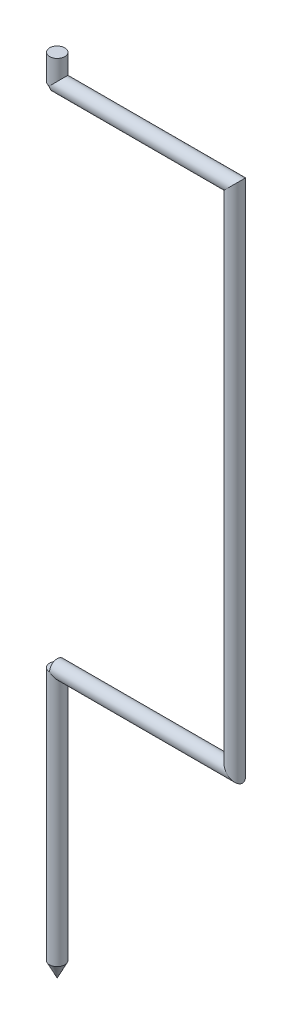
ISO-10303-21;
HEADER;
FILE_DESCRIPTION(('STEP AP214'),'2;1');
FILE_NAME('part.step','',(''),(''),'','','');
FILE_SCHEMA(('AUTOMOTIVE_DESIGN { 1 0 10303 214 1 1 1 1 }'));
ENDSEC;
DATA;
#1=APPLICATION_CONTEXT('core data for automotive mechanical design processes');
#2=APPLICATION_PROTOCOL_DEFINITION('international standard','automotive_design',2000,#1);
#3=PRODUCT_CONTEXT('',#1,'mechanical');
#4=PRODUCT('Part','Part','',(#3));
#5=PRODUCT_RELATED_PRODUCT_CATEGORY('part','',(#4));
#6=PRODUCT_DEFINITION_FORMATION('','',#4);
#7=PRODUCT_DEFINITION_CONTEXT('part definition',#1,'design');
#8=PRODUCT_DEFINITION('design','',#6,#7);
#9=PRODUCT_DEFINITION_SHAPE('','',#8);
#10=(LENGTH_UNIT() NAMED_UNIT(*) SI_UNIT(.MILLI.,.METRE.));
#11=(NAMED_UNIT(*) PLANE_ANGLE_UNIT() SI_UNIT($,.RADIAN.));
#12=(NAMED_UNIT(*) SI_UNIT($,.STERADIAN.) SOLID_ANGLE_UNIT());
#13=UNCERTAINTY_MEASURE_WITH_UNIT(LENGTH_MEASURE(1.E-05),#10,'distance_accuracy_value','');
#14=(GEOMETRIC_REPRESENTATION_CONTEXT(3) GLOBAL_UNCERTAINTY_ASSIGNED_CONTEXT((#13)) GLOBAL_UNIT_ASSIGNED_CONTEXT((#10,
#11,#12)) REPRESENTATION_CONTEXT('',''));
#15=CARTESIAN_POINT('',(0.,0.,0.));
#16=DIRECTION('',(0.,0.,1.));
#17=DIRECTION('',(1.,0.,0.));
#18=AXIS2_PLACEMENT_3D('',#15,#16,#17);
#19=CARTESIAN_POINT('',(76.7,306.,0.));
#20=DIRECTION('',(-1.,0.,0.));
#21=DIRECTION('',(0.,0.,1.));
#22=AXIS2_PLACEMENT_3D('',#19,#20,#21);
#23=CYLINDRICAL_SURFACE('',#22,3.);
#24=CARTESIAN_POINT('',(70.,306.,0.));
#25=DIRECTION('',(-0.707106781186548,0.707106781186548,0.));
#26=DIRECTION('',(0.707106781186548,0.707106781186548,0.));
#27=AXIS2_PLACEMENT_3D('',#24,#25,#26);
#28=ELLIPSE('',#27,4.24264068711928,3.);
#29=CARTESIAN_POINT('',(73.,309.,0.));
#30=VERTEX_POINT('',#29);
#31=EDGE_CURVE('E80',#30,#30,#28,.T.);
#32=ORIENTED_EDGE('',*,*,#31,.T.);
#33=EDGE_LOOP('',(#32));
#34=FACE_BOUND('',#33,.T.);
#35=CARTESIAN_POINT('',(0.,306.,0.));
#36=DIRECTION('',(-0.707106781186547,0.707106781186547,0.));
#37=DIRECTION('',(-0.707106781186547,-0.707106781186547,0.));
#38=AXIS2_PLACEMENT_3D('',#35,#36,#37);
#39=ELLIPSE('',#38,4.24264068711928,3.);
#40=CARTESIAN_POINT('',(0.,306.,3.));
#41=VERTEX_POINT('',#40);
#42=CARTESIAN_POINT('',(0.,306.,-3.));
#43=VERTEX_POINT('',#42);
#44=EDGE_CURVE('E12',#41,#43,#39,.T.);
#45=ORIENTED_EDGE('',*,*,#44,.F.);
#46=CARTESIAN_POINT('',(0.,306.,-3.));
#47=CARTESIAN_POINT('',(0.,305.75,-3.));
#48=CARTESIAN_POINT('',(0.,305.4672,-2.9696));
#49=CARTESIAN_POINT('',(0.,304.8528,-2.7904));
#50=CARTESIAN_POINT('',(0.,304.52,-2.64));
#51=CARTESIAN_POINT('',(0.,304.04,-2.28));
#52=CARTESIAN_POINT('',(0.,303.883843122537,-2.13773691124038));
#53=CARTESIAN_POINT('',(0.,303.595608932257,-1.80746856821167));
#54=CARTESIAN_POINT('',(0.,303.463667820069,-1.61937716262976));
#55=CARTESIAN_POINT('',(0.,303.242214532872,-1.20415224913495));
#56=CARTESIAN_POINT('',(0.,303.152899408284,-0.977041420118344));
#57=CARTESIAN_POINT('',(0.,303.031715976331,-0.499881656804734));
#58=CARTESIAN_POINT('',(0.,303.,-0.25));
#59=CARTESIAN_POINT('',(0.,303.,0.25));
#60=CARTESIAN_POINT('',(0.,303.031715976331,0.499881656804734));
#61=CARTESIAN_POINT('',(0.,303.152899408284,0.977041420118344));
#62=CARTESIAN_POINT('',(0.,303.242214532872,1.20415224913495));
#63=CARTESIAN_POINT('',(0.,303.463667820069,1.61937716262976));
#64=CARTESIAN_POINT('',(0.,303.595608932257,1.80746856821167));
#65=CARTESIAN_POINT('',(0.,303.883843122537,2.13773691124038));
#66=CARTESIAN_POINT('',(0.,304.04,2.28));
#67=CARTESIAN_POINT('',(0.,304.52,2.64));
#68=CARTESIAN_POINT('',(0.,304.8528,2.7904));
#69=CARTESIAN_POINT('',(0.,305.4672,2.9696));
#70=CARTESIAN_POINT('',(0.,305.75,3.));
#71=CARTESIAN_POINT('',(0.,306.,3.));
#72=B_SPLINE_CURVE_WITH_KNOTS('',3,(#46,#47,#48,#49,#50,#51,#52,#53,#54,#55,#56,#57,#58,#59,#60,
#61,#62,#63,#64,#65,#66,#67,#68,#69,#70,#71),.UNSPECIFIED.,.F.,.F.,(4,2,2,2,2,2,2,2,2,2,2,2,4),
(0.,0.125,0.250000000000014,0.3125,0.375,0.4375,0.5,0.5625,0.625,0.6875,0.75,0.875,1.),.UNSPECIFIED.);
#73=EDGE_CURVE('E72',#41,#43,#72,.F.);
#74=ORIENTED_EDGE('',*,*,#73,.T.);
#75=EDGE_LOOP('',(#45,#74));
#76=FACE_BOUND('',#75,.T.);
#77=ADVANCED_FACE('F41',(#34,#76),#23,.T.);
#78=CARTESIAN_POINT('',(0.,106.,0.));
#79=DIRECTION('',(0.,-1.,0.));
#80=DIRECTION('',(0.,0.,-1.));
#81=AXIS2_PLACEMENT_3D('',#78,#79,#80);
#82=CYLINDRICAL_SURFACE('',#81,3.);
#83=CARTESIAN_POINT('',(0.,6.,0.));
#84=DIRECTION('',(0.,1.,0.));
#85=DIRECTION('',(0.,0.,1.));
#86=AXIS2_PLACEMENT_3D('',#83,#84,#85);
#87=CIRCLE('',#86,3.);
#88=CARTESIAN_POINT('',(0.,6.,3.));
#89=VERTEX_POINT('',#88);
#90=EDGE_CURVE('E135',#89,#89,#87,.T.);
#91=ORIENTED_EDGE('',*,*,#90,.T.);
#92=EDGE_LOOP('',(#91));
#93=FACE_BOUND('',#92,.T.);
#94=CARTESIAN_POINT('',(0.,106.,0.));
#95=DIRECTION('',(-0.707106781186547,-0.707106781186547,0.));
#96=DIRECTION('',(0.707106781186547,-0.707106781186547,0.));
#97=AXIS2_PLACEMENT_3D('',#94,#95,#96);
#98=ELLIPSE('',#97,4.24264068711928,3.);
#99=CARTESIAN_POINT('',(0.,106.,3.));
#100=VERTEX_POINT('',#99);
#101=CARTESIAN_POINT('',(0.,106.,-3.));
#102=VERTEX_POINT('',#101);
#103=EDGE_CURVE('E138',#100,#102,#98,.F.);
#104=ORIENTED_EDGE('',*,*,#103,.F.);
#105=CARTESIAN_POINT('',(0.,106.,0.));
#106=DIRECTION('',(0.,1.,0.));
#107=DIRECTION('',(0.,0.,1.));
#108=AXIS2_PLACEMENT_3D('',#105,#106,#107);
#109=CIRCLE('',#108,3.);
#110=EDGE_CURVE('E139',#102,#100,#109,.T.);
#111=ORIENTED_EDGE('',*,*,#110,.F.);
#112=EDGE_LOOP('',(#104,#111));
#113=FACE_BOUND('',#112,.T.);
#114=ADVANCED_FACE('F43',(#93,#113),#82,.T.);
#115=CARTESIAN_POINT('',(0.,106.,0.));
#116=DIRECTION('',(0.,1.,0.));
#117=DIRECTION('',(0.,0.,1.));
#118=AXIS2_PLACEMENT_3D('',#115,#116,#117);
#119=PLANE('',#118);
#120=DIRECTION('',(0.,0.,1.));
#121=VECTOR('',#120,1.);
#122=CARTESIAN_POINT('',(0.,106.,0.));
#123=LINE('',#122,#121);
#124=EDGE_CURVE('E52',#102,#100,#123,.T.);
#125=ORIENTED_EDGE('',*,*,#124,.F.);
#126=ORIENTED_EDGE('',*,*,#110,.T.);
#127=EDGE_LOOP('',(#125,#126));
#128=FACE_BOUND('',#127,.T.);
#129=ADVANCED_FACE('F123',(#128),#119,.T.);
#130=CARTESIAN_POINT('',(0.,0.,0.));
#131=DIRECTION('',(0.,1.,0.));
#132=DIRECTION('',(0.,0.,1.));
#133=AXIS2_PLACEMENT_3D('',#130,#131,#132);
#134=CONICAL_SURFACE('',#133,0.,0.463647609000806);
#135=ORIENTED_EDGE('',*,*,#90,.F.);
#136=EDGE_LOOP('',(#135));
#137=FACE_BOUND('',#136,.T.);
#138=CARTESIAN_POINT('',(0.,0.,0.));
#139=VERTEX_POINT('',#138);
#140=VERTEX_LOOP('',#139);
#141=FACE_BOUND('',#140,.T.);
#142=ADVANCED_FACE('F111',(#137,#141),#134,.T.);
#143=CARTESIAN_POINT('',(0.,106.,0.));
#144=DIRECTION('',(1.,0.,0.));
#145=DIRECTION('',(0.,0.,-1.));
#146=AXIS2_PLACEMENT_3D('',#143,#144,#145);
#147=CYLINDRICAL_SURFACE('',#146,3.);
#148=CARTESIAN_POINT('',(70.,106.,0.));
#149=DIRECTION('',(0.707106781186548,0.707106781186548,0.));
#150=DIRECTION('',(0.707106781186548,-0.707106781186548,0.));
#151=AXIS2_PLACEMENT_3D('',#148,#149,#150);
#152=ELLIPSE('',#151,4.24264068711928,3.);
#153=CARTESIAN_POINT('',(73.,103.,0.));
#154=VERTEX_POINT('',#153);
#155=EDGE_CURVE('E143',#154,#154,#152,.T.);
#156=ORIENTED_EDGE('',*,*,#155,.F.);
#157=EDGE_LOOP('',(#156));
#158=FACE_BOUND('',#157,.T.);
#159=CARTESIAN_POINT('',(0.,106.,0.));
#160=DIRECTION('',(-1.,0.,0.));
#161=DIRECTION('',(0.,0.,-1.));
#162=AXIS2_PLACEMENT_3D('',#159,#160,#161);
#163=CIRCLE('',#162,3.);
#164=EDGE_CURVE('E145',#100,#102,#163,.T.);
#165=ORIENTED_EDGE('',*,*,#164,.F.);
#166=ORIENTED_EDGE('',*,*,#103,.T.);
#167=EDGE_LOOP('',(#165,#166));
#168=FACE_BOUND('',#167,.T.);
#169=ADVANCED_FACE('F108',(#158,#168),#147,.T.);
#170=CARTESIAN_POINT('',(0.,106.,0.));
#171=DIRECTION('',(-1.,0.,0.));
#172=DIRECTION('',(0.,0.,-1.));
#173=AXIS2_PLACEMENT_3D('',#170,#171,#172);
#174=PLANE('',#173);
#175=ORIENTED_EDGE('',*,*,#164,.T.);
#176=ORIENTED_EDGE('',*,*,#124,.T.);
#177=EDGE_LOOP('',(#175,#176));
#178=FACE_BOUND('',#177,.T.);
#179=ADVANCED_FACE('F106',(#178),#174,.T.);
#180=CARTESIAN_POINT('',(70.,99.3,0.));
#181=DIRECTION('',(0.,1.,0.));
#182=DIRECTION('',(0.,0.,1.));
#183=AXIS2_PLACEMENT_3D('',#180,#181,#182);
#184=CYLINDRICAL_SURFACE('',#183,3.);
#185=ORIENTED_EDGE('',*,*,#155,.T.);
#186=EDGE_LOOP('',(#185));
#187=FACE_BOUND('',#186,.T.);
#188=ORIENTED_EDGE('',*,*,#31,.F.);
#189=EDGE_LOOP('',(#188));
#190=FACE_BOUND('',#189,.T.);
#191=ADVANCED_FACE('F104',(#187,#190),#184,.T.);
#192=CARTESIAN_POINT('',(0.,316.,0.));
#193=DIRECTION('',(0.,-1.,0.));
#194=DIRECTION('',(0.,0.,-1.));
#195=AXIS2_PLACEMENT_3D('',#192,#193,#194);
#196=CYLINDRICAL_SURFACE('',#195,3.);
#197=CARTESIAN_POINT('',(0.,316.,0.));
#198=DIRECTION('',(0.,1.,0.));
#199=DIRECTION('',(0.,0.,1.));
#200=AXIS2_PLACEMENT_3D('',#197,#198,#199);
#201=CIRCLE('',#200,3.);
#202=CARTESIAN_POINT('',(0.,316.,3.));
#203=VERTEX_POINT('',#202);
#204=EDGE_CURVE('E81',#203,#203,#201,.T.);
#205=ORIENTED_EDGE('',*,*,#204,.F.);
#206=EDGE_LOOP('',(#205));
#207=FACE_BOUND('',#206,.T.);
#208=CARTESIAN_POINT('',(0.,306.,3.));
#209=CARTESIAN_POINT('',(-0.25,306.,3.));
#210=CARTESIAN_POINT('',(-0.5328,306.,2.9696));
#211=CARTESIAN_POINT('',(-1.1472,306.,2.7904));
#212=CARTESIAN_POINT('',(-1.48,306.,2.64));
#213=CARTESIAN_POINT('',(-1.96,306.,2.28));
#214=CARTESIAN_POINT('',(-2.11615687746294,306.,2.13773691124038));
#215=CARTESIAN_POINT('',(-2.40439106774254,306.,1.80746856821167));
#216=CARTESIAN_POINT('',(-2.5363321799308,306.,1.61937716262976));
#217=CARTESIAN_POINT('',(-2.75778546712803,306.,1.20415224913495));
#218=CARTESIAN_POINT('',(-2.84710059171598,306.,0.977041420118343));
#219=CARTESIAN_POINT('',(-2.96828402366864,306.,0.499881656804734));
#220=CARTESIAN_POINT('',(-3.,306.,0.249999999999999));
#221=CARTESIAN_POINT('',(-3.,306.,-0.25));
#222=CARTESIAN_POINT('',(-2.96828402366864,306.,-0.499881656804734));
#223=CARTESIAN_POINT('',(-2.84710059171598,306.,-0.977041420118344));
#224=CARTESIAN_POINT('',(-2.75778546712803,306.,-1.20415224913495));
#225=CARTESIAN_POINT('',(-2.5363321799308,306.,-1.61937716262976));
#226=CARTESIAN_POINT('',(-2.40439106774254,306.,-1.80746856821167));
#227=CARTESIAN_POINT('',(-2.11615687746294,306.,-2.13773691124038));
#228=CARTESIAN_POINT('',(-1.96,306.,-2.28));
#229=CARTESIAN_POINT('',(-1.48,306.,-2.64));
#230=CARTESIAN_POINT('',(-1.1472,306.,-2.7904));
#231=CARTESIAN_POINT('',(-0.5328,306.,-2.9696));
#232=CARTESIAN_POINT('',(-0.249999999999999,306.,-3.));
#233=CARTESIAN_POINT('',(0.,306.,-3.));
#234=B_SPLINE_CURVE_WITH_KNOTS('',3,(#208,#209,#210,#211,#212,#213,#214,#215,#216,#217,#218,
#219,#220,#221,#222,#223,#224,#225,#226,#227,#228,#229,#230,#231,#232,#233),.UNSPECIFIED.,.F.,
.F.,(4,2,2,2,2,2,2,2,2,2,2,2,4),(0.,0.125,0.25,0.3125,0.375,0.4375,0.5,0.5625,0.625,0.6875,
0.749999999999986,0.875,1.),.UNSPECIFIED.);
#235=EDGE_CURVE('E77',#43,#41,#234,.F.);
#236=ORIENTED_EDGE('',*,*,#235,.T.);
#237=ORIENTED_EDGE('',*,*,#44,.T.);
#238=EDGE_LOOP('',(#236,#237));
#239=FACE_BOUND('',#238,.T.);
#240=ADVANCED_FACE('F86',(#207,#239),#196,.T.);
#241=CARTESIAN_POINT('',(0.,316.,0.));
#242=DIRECTION('',(0.,1.,0.));
#243=DIRECTION('',(0.,0.,1.));
#244=AXIS2_PLACEMENT_3D('',#241,#242,#243);
#245=PLANE('',#244);
#246=ORIENTED_EDGE('',*,*,#204,.T.);
#247=EDGE_LOOP('',(#246));
#248=FACE_BOUND('',#247,.T.);
#249=ADVANCED_FACE('F103',(#248),#245,.T.);
#250=CARTESIAN_POINT('',(0.,306.,3.));
#251=CARTESIAN_POINT('',(0.,306.,3.));
#252=CARTESIAN_POINT('',(-0.25,306.,3.));
#253=CARTESIAN_POINT('',(0.,305.75,3.));
#254=CARTESIAN_POINT('',(-0.5328,306.,2.9696));
#255=CARTESIAN_POINT('',(0.,305.4672,2.9696));
#256=CARTESIAN_POINT('',(-1.1472,306.,2.7904));
#257=CARTESIAN_POINT('',(0.,304.8528,2.7904));
#258=CARTESIAN_POINT('',(-1.48,306.,2.64));
#259=CARTESIAN_POINT('',(0.,304.52,2.64));
#260=CARTESIAN_POINT('',(-1.96,306.,2.28));
#261=CARTESIAN_POINT('',(0.,304.04,2.28));
#262=CARTESIAN_POINT('',(-2.11615687746294,306.,2.13773691124038));
#263=CARTESIAN_POINT('',(0.,303.883843122537,2.13773691124038));
#264=CARTESIAN_POINT('',(-2.40439106774254,306.,1.80746856821167));
#265=CARTESIAN_POINT('',(0.,303.595608932257,1.80746856821167));
#266=CARTESIAN_POINT('',(-2.5363321799308,306.,1.61937716262976));
#267=CARTESIAN_POINT('',(0.,303.463667820069,1.61937716262976));
#268=CARTESIAN_POINT('',(-2.75778546712803,306.,1.20415224913495));
#269=CARTESIAN_POINT('',(0.,303.242214532872,1.20415224913495));
#270=CARTESIAN_POINT('',(-2.84710059171598,306.,0.977041420118343));
#271=CARTESIAN_POINT('',(0.,303.152899408284,0.977041420118344));
#272=CARTESIAN_POINT('',(-2.96828402366864,306.,0.499881656804734));
#273=CARTESIAN_POINT('',(0.,303.031715976331,0.499881656804734));
#274=CARTESIAN_POINT('',(-3.,306.,0.249999999999999));
#275=CARTESIAN_POINT('',(0.,303.,0.25));
#276=CARTESIAN_POINT('',(-3.,306.,-0.25));
#277=CARTESIAN_POINT('',(0.,303.,-0.25));
#278=CARTESIAN_POINT('',(-2.96828402366864,306.,-0.499881656804734));
#279=CARTESIAN_POINT('',(0.,303.031715976331,-0.499881656804734));
#280=CARTESIAN_POINT('',(-2.84710059171598,306.,-0.977041420118344));
#281=CARTESIAN_POINT('',(0.,303.152899408284,-0.977041420118344));
#282=CARTESIAN_POINT('',(-2.75778546712803,306.,-1.20415224913495));
#283=CARTESIAN_POINT('',(0.,303.242214532872,-1.20415224913495));
#284=CARTESIAN_POINT('',(-2.5363321799308,306.,-1.61937716262976));
#285=CARTESIAN_POINT('',(0.,303.463667820069,-1.61937716262976));
#286=CARTESIAN_POINT('',(-2.40439106774254,306.,-1.80746856821167));
#287=CARTESIAN_POINT('',(0.,303.595608932257,-1.80746856821167));
#288=CARTESIAN_POINT('',(-2.11615687746294,306.,-2.13773691124038));
#289=CARTESIAN_POINT('',(0.,303.883843122537,-2.13773691124038));
#290=CARTESIAN_POINT('',(-1.96,306.,-2.28));
#291=CARTESIAN_POINT('',(0.,304.04,-2.28));
#292=CARTESIAN_POINT('',(-1.48,306.,-2.64));
#293=CARTESIAN_POINT('',(0.,304.52,-2.64));
#294=CARTESIAN_POINT('',(-1.1472,306.,-2.7904));
#295=CARTESIAN_POINT('',(0.,304.8528,-2.7904));
#296=CARTESIAN_POINT('',(-0.5328,306.,-2.9696));
#297=CARTESIAN_POINT('',(0.,305.4672,-2.9696));
#298=CARTESIAN_POINT('',(-0.249999999999999,306.,-3.));
#299=CARTESIAN_POINT('',(0.,305.75,-3.));
#300=CARTESIAN_POINT('',(0.,306.,-3.));
#301=CARTESIAN_POINT('',(0.,306.,-3.));
#302=B_SPLINE_SURFACE_WITH_KNOTS('',3,1,((#250,#251),(#252,#253),(#254,#255),(#256,#257),(#258,
#259),(#260,#261),(#262,#263),(#264,#265),(#266,#267),(#268,#269),(#270,#271),(#272,#273),(#274,
#275),(#276,#277),(#278,#279),(#280,#281),(#282,#283),(#284,#285),(#286,#287),(#288,#289),(#290,
#291),(#292,#293),(#294,#295),(#296,#297),(#298,#299),(#300,#301)),.UNSPECIFIED.,.F.,.F.,.F.,(4,
2,2,2,2,2,2,2,2,2,2,2,4),(2,2),(0.,0.125,0.25,0.3125,0.375,0.4375,0.5,0.5625,0.625,0.6875,
0.749999999999986,0.875,1.),(0.,1.),.UNSPECIFIED.);
#303=ORIENTED_EDGE('',*,*,#235,.F.);
#304=ORIENTED_EDGE('',*,*,#73,.F.);
#305=EDGE_LOOP('',(#303,#304));
#306=FACE_BOUND('',#305,.T.);
#307=ADVANCED_FACE('F75',(#306),#302,.T.);
#308=CLOSED_SHELL('',(#77,#114,#129,#142,#169,#179,#191,#240,#249,#307));
#309=MANIFOLD_SOLID_BREP('B2',#308);
#310=ADVANCED_BREP_SHAPE_REPRESENTATION('',(#18,#309),#14);
#311=SHAPE_DEFINITION_REPRESENTATION(#9,#310);
ENDSEC;
END-ISO-10303-21;
